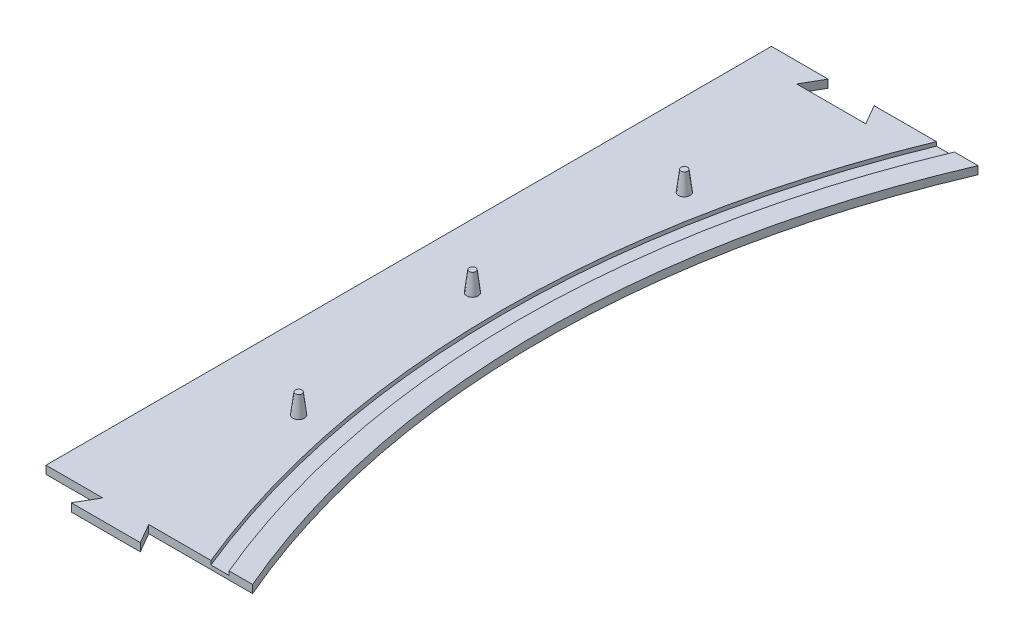
ISO-10303-21;
HEADER;
FILE_DESCRIPTION(('STEP AP214'),'2;1');
FILE_NAME('part.step','',(''),(''),'','','');
FILE_SCHEMA(('AUTOMOTIVE_DESIGN { 1 0 10303 214 1 1 1 1 }'));
ENDSEC;
DATA;
#1=APPLICATION_CONTEXT('core data for automotive mechanical design processes');
#2=APPLICATION_PROTOCOL_DEFINITION('international standard','automotive_design',2000,#1);
#3=PRODUCT_CONTEXT('',#1,'mechanical');
#4=PRODUCT('Part','Part','',(#3));
#5=PRODUCT_RELATED_PRODUCT_CATEGORY('part','',(#4));
#6=PRODUCT_DEFINITION_FORMATION('','',#4);
#7=PRODUCT_DEFINITION_CONTEXT('part definition',#1,'design');
#8=PRODUCT_DEFINITION('design','',#6,#7);
#9=PRODUCT_DEFINITION_SHAPE('','',#8);
#10=(LENGTH_UNIT() NAMED_UNIT(*) SI_UNIT(.MILLI.,.METRE.));
#11=(NAMED_UNIT(*) PLANE_ANGLE_UNIT() SI_UNIT($,.RADIAN.));
#12=(NAMED_UNIT(*) SI_UNIT($,.STERADIAN.) SOLID_ANGLE_UNIT());
#13=UNCERTAINTY_MEASURE_WITH_UNIT(LENGTH_MEASURE(1.E-05),#10,'distance_accuracy_value','');
#14=(GEOMETRIC_REPRESENTATION_CONTEXT(3) GLOBAL_UNCERTAINTY_ASSIGNED_CONTEXT((#13)) GLOBAL_UNIT_ASSIGNED_CONTEXT((#10,
#11,#12)) REPRESENTATION_CONTEXT('',''));
#15=CARTESIAN_POINT('',(0.,0.,0.));
#16=DIRECTION('',(0.,0.,1.));
#17=DIRECTION('',(1.,0.,0.));
#18=AXIS2_PLACEMENT_3D('',#15,#16,#17);
#19=CARTESIAN_POINT('',(0.,0.,0.));
#20=DIRECTION('',(0.,1.,0.));
#21=DIRECTION('',(0.,0.,1.));
#22=AXIS2_PLACEMENT_3D('',#19,#20,#21);
#23=PLANE('',#22);
#24=DIRECTION('',(-1.,0.,0.));
#25=VECTOR('',#24,1.);
#26=CARTESIAN_POINT('',(0.,0.,-90.9999999999999));
#27=LINE('',#26,#25);
#28=CARTESIAN_POINT('',(-212.176813059297,0.,-91.));
#29=VERTEX_POINT('',#28);
#30=CARTESIAN_POINT('',(-218.074964175166,0.,-91.));
#31=VERTEX_POINT('',#30);
#32=EDGE_CURVE('E237',#29,#31,#27,.T.);
#33=ORIENTED_EDGE('',*,*,#32,.T.);
#34=CARTESIAN_POINT('',(0.,0.,0.));
#35=DIRECTION('',(0.,1.,0.));
#36=DIRECTION('',(0.,0.,1.));
#37=AXIS2_PLACEMENT_3D('',#34,#35,#36);
#38=CIRCLE('',#37,236.3);
#39=CARTESIAN_POINT('',(-218.074964175166,0.,91.));
#40=VERTEX_POINT('',#39);
#41=EDGE_CURVE('E52',#31,#40,#38,.T.);
#42=ORIENTED_EDGE('',*,*,#41,.T.);
#43=DIRECTION('',(1.,0.,0.));
#44=VECTOR('',#43,1.);
#45=CARTESIAN_POINT('',(0.,0.,90.9999999999999));
#46=LINE('',#45,#44);
#47=CARTESIAN_POINT('',(-212.176813059297,0.,91.));
#48=VERTEX_POINT('',#47);
#49=EDGE_CURVE('E250',#40,#48,#46,.T.);
#50=ORIENTED_EDGE('',*,*,#49,.T.);
#51=CARTESIAN_POINT('',(0.,0.,0.));
#52=DIRECTION('',(0.,1.,0.));
#53=DIRECTION('',(-0.866025403784443,0.,-0.499999999999992));
#54=AXIS2_PLACEMENT_3D('',#51,#52,#53);
#55=CIRCLE('',#54,230.867927612304);
#56=EDGE_CURVE('E228',#29,#48,#55,.T.);
#57=ORIENTED_EDGE('',*,*,#56,.F.);
#58=EDGE_LOOP('',(#33,#42,#50,#57));
#59=FACE_BOUND('',#58,.T.);
#60=ADVANCED_FACE('F36',(#59),#23,.T.);
#61=CARTESIAN_POINT('',(-200.,8.,-91.));
#62=DIRECTION('',(0.,0.,-1.));
#63=DIRECTION('',(-1.,0.,0.));
#64=AXIS2_PLACEMENT_3D('',#61,#62,#63);
#65=PLANE('',#64);
#66=DIRECTION('',(0.,1.,0.));
#67=VECTOR('',#66,1.);
#68=CARTESIAN_POINT('',(-249.773502691896,8.,-91.));
#69=LINE('',#68,#67);
#70=CARTESIAN_POINT('',(-249.773502691896,-2.,-91.));
#71=VERTEX_POINT('',#70);
#72=CARTESIAN_POINT('',(-249.773502691896,0.,-91.));
#73=VERTEX_POINT('',#72);
#74=EDGE_CURVE('E158',#71,#73,#69,.T.);
#75=ORIENTED_EDGE('',*,*,#74,.F.);
#76=DIRECTION('',(1.,0.,0.));
#77=VECTOR('',#76,1.);
#78=CARTESIAN_POINT('',(-200.,-2.,-91.));
#79=LINE('',#78,#77);
#80=CARTESIAN_POINT('',(-264.,-2.,-91.));
#81=VERTEX_POINT('',#80);
#82=EDGE_CURVE('E251',#81,#71,#79,.T.);
#83=ORIENTED_EDGE('',*,*,#82,.F.);
#84=DIRECTION('',(0.,-1.,0.));
#85=VECTOR('',#84,1.);
#86=CARTESIAN_POINT('',(-264.,-2.,-91.));
#87=LINE('',#86,#85);
#88=CARTESIAN_POINT('',(-264.,0.,-91.));
#89=VERTEX_POINT('',#88);
#90=EDGE_CURVE('E231',#89,#81,#87,.T.);
#91=ORIENTED_EDGE('',*,*,#90,.F.);
#92=EDGE_CURVE('E240',#73,#89,#27,.T.);
#93=ORIENTED_EDGE('',*,*,#92,.F.);
#94=EDGE_LOOP('',(#75,#83,#91,#93));
#95=FACE_BOUND('',#94,.T.);
#96=ADVANCED_FACE('F358',(#95),#65,.T.);
#97=CARTESIAN_POINT('',(-200.,8.,91.));
#98=DIRECTION('',(0.,0.,1.));
#99=DIRECTION('',(1.,0.,0.));
#100=AXIS2_PLACEMENT_3D('',#97,#98,#99);
#101=PLANE('',#100);
#102=DIRECTION('',(0.,-1.,0.));
#103=VECTOR('',#102,1.);
#104=CARTESIAN_POINT('',(-249.773502691896,8.,91.));
#105=LINE('',#104,#103);
#106=CARTESIAN_POINT('',(-249.773502691896,0.,91.));
#107=VERTEX_POINT('',#106);
#108=CARTESIAN_POINT('',(-249.773502691896,-2.,91.));
#109=VERTEX_POINT('',#108);
#110=EDGE_CURVE('E180',#107,#109,#105,.T.);
#111=ORIENTED_EDGE('',*,*,#110,.F.);
#112=CARTESIAN_POINT('',(-264.,0.,91.));
#113=VERTEX_POINT('',#112);
#114=EDGE_CURVE('E245',#113,#107,#46,.T.);
#115=ORIENTED_EDGE('',*,*,#114,.F.);
#116=DIRECTION('',(0.,1.,0.));
#117=VECTOR('',#116,1.);
#118=CARTESIAN_POINT('',(-264.,-2.,91.));
#119=LINE('',#118,#117);
#120=CARTESIAN_POINT('',(-264.,-2.,91.));
#121=VERTEX_POINT('',#120);
#122=EDGE_CURVE('E241',#121,#113,#119,.T.);
#123=ORIENTED_EDGE('',*,*,#122,.F.);
#124=DIRECTION('',(-1.,0.,0.));
#125=VECTOR('',#124,1.);
#126=CARTESIAN_POINT('',(-200.,-2.,91.));
#127=LINE('',#126,#125);
#128=EDGE_CURVE('E260',#109,#121,#127,.T.);
#129=ORIENTED_EDGE('',*,*,#128,.F.);
#130=EDGE_LOOP('',(#111,#115,#123,#129));
#131=FACE_BOUND('',#130,.T.);
#132=ADVANCED_FACE('F362',(#131),#101,.T.);
#133=CARTESIAN_POINT('',(0.,-2.,0.));
#134=DIRECTION('',(0.,1.,0.));
#135=DIRECTION('',(0.,0.,1.));
#136=AXIS2_PLACEMENT_3D('',#133,#134,#135);
#137=PLANE('',#136);
#138=ORIENTED_EDGE('',*,*,#82,.T.);
#139=DIRECTION('',(0.499999999999998,0.,-0.86602540378444));
#140=VECTOR('',#139,1.);
#141=CARTESIAN_POINT('',(-244.,-2.,-101.));
#142=LINE('',#141,#140);
#143=CARTESIAN_POINT('',(-252.660254037844,-2.,-86.));
#144=VERTEX_POINT('',#143);
#145=EDGE_CURVE('E300',#144,#71,#142,.T.);
#146=ORIENTED_EDGE('',*,*,#145,.F.);
#147=DIRECTION('',(-1.,0.,0.));
#148=VECTOR('',#147,1.);
#149=CARTESIAN_POINT('',(-252.660254037844,-2.,-86.));
#150=LINE('',#149,#148);
#151=CARTESIAN_POINT('',(-235.339745962156,-2.,-86.));
#152=VERTEX_POINT('',#151);
#153=EDGE_CURVE('E291',#152,#144,#150,.T.);
#154=ORIENTED_EDGE('',*,*,#153,.F.);
#155=DIRECTION('',(0.500000000000001,0.,0.866025403784438));
#156=VECTOR('',#155,1.);
#157=CARTESIAN_POINT('',(-235.339745962156,-2.,-86.));
#158=LINE('',#157,#156);
#159=CARTESIAN_POINT('',(-238.226497308104,-2.,-91.));
#160=VERTEX_POINT('',#159);
#161=EDGE_CURVE('E284',#160,#152,#158,.T.);
#162=ORIENTED_EDGE('',*,*,#161,.F.);
#163=CARTESIAN_POINT('',(-212.176813059297,-2.,-91.));
#164=VERTEX_POINT('',#163);
#165=EDGE_CURVE('E255',#160,#164,#79,.T.);
#166=ORIENTED_EDGE('',*,*,#165,.T.);
#167=CARTESIAN_POINT('',(0.,-2.,0.));
#168=DIRECTION('',(0.,1.,0.));
#169=DIRECTION('',(-0.866025403784443,0.,-0.499999999999992));
#170=AXIS2_PLACEMENT_3D('',#167,#168,#169);
#171=CIRCLE('',#170,230.867927612304);
#172=CARTESIAN_POINT('',(-212.176813059297,-2.,91.));
#173=VERTEX_POINT('',#172);
#174=EDGE_CURVE('E227',#164,#173,#171,.T.);
#175=ORIENTED_EDGE('',*,*,#174,.T.);
#176=CARTESIAN_POINT('',(-238.226497308104,-2.,91.));
#177=VERTEX_POINT('',#176);
#178=EDGE_CURVE('E256',#173,#177,#127,.T.);
#179=ORIENTED_EDGE('',*,*,#178,.T.);
#180=DIRECTION('',(0.5,0.,0.866025403784438));
#181=VECTOR('',#180,1.);
#182=CARTESIAN_POINT('',(-235.339745962156,-2.,96.));
#183=LINE('',#182,#181);
#184=CARTESIAN_POINT('',(-235.339745962156,-2.,96.));
#185=VERTEX_POINT('',#184);
#186=EDGE_CURVE('E273',#177,#185,#183,.T.);
#187=ORIENTED_EDGE('',*,*,#186,.T.);
#188=DIRECTION('',(-1.,0.,0.));
#189=VECTOR('',#188,1.);
#190=CARTESIAN_POINT('',(-252.660254037844,-2.,96.));
#191=LINE('',#190,#189);
#192=CARTESIAN_POINT('',(-252.660254037844,-2.,96.));
#193=VERTEX_POINT('',#192);
#194=EDGE_CURVE('E261',#185,#193,#191,.T.);
#195=ORIENTED_EDGE('',*,*,#194,.T.);
#196=DIRECTION('',(0.5,0.,-0.866025403784438));
#197=VECTOR('',#196,1.);
#198=CARTESIAN_POINT('',(-244.,-2.,81.));
#199=LINE('',#198,#197);
#200=EDGE_CURVE('E264',#193,#109,#199,.T.);
#201=ORIENTED_EDGE('',*,*,#200,.T.);
#202=ORIENTED_EDGE('',*,*,#128,.T.);
#203=DIRECTION('',(0.,0.,1.));
#204=VECTOR('',#203,1.);
#205=CARTESIAN_POINT('',(-264.,-2.,-131.979594929244));
#206=LINE('',#205,#204);
#207=EDGE_CURVE('E195',#81,#121,#206,.T.);
#208=ORIENTED_EDGE('',*,*,#207,.F.);
#209=EDGE_LOOP('',(#138,#146,#154,#162,#166,#175,#179,#187,#195,#201,#202,#208));
#210=FACE_BOUND('',#209,.T.);
#211=ADVANCED_FACE('F367',(#210),#137,.F.);
#212=CARTESIAN_POINT('',(0.,0.,0.));
#213=DIRECTION('',(0.,1.,0.));
#214=DIRECTION('',(0.,0.,1.));
#215=AXIS2_PLACEMENT_3D('',#212,#213,#214);
#216=CIRCLE('',#215,240.5);
#217=CARTESIAN_POINT('',(-222.619069264068,0.,-91.));
#218=VERTEX_POINT('',#217);
#219=CARTESIAN_POINT('',(-222.619069264068,0.,91.));
#220=VERTEX_POINT('',#219);
#221=EDGE_CURVE('E167',#218,#220,#216,.T.);
#222=ORIENTED_EDGE('',*,*,#221,.F.);
#223=CARTESIAN_POINT('',(-238.226497308104,0.,-91.));
#224=VERTEX_POINT('',#223);
#225=EDGE_CURVE('E60',#218,#224,#27,.T.);
#226=ORIENTED_EDGE('',*,*,#225,.T.);
#227=DIRECTION('',(-0.5,0.,-0.866025403784438));
#228=VECTOR('',#227,1.);
#229=CARTESIAN_POINT('',(-235.339745962156,0.,-86.));
#230=LINE('',#229,#228);
#231=CARTESIAN_POINT('',(-235.339745962156,0.,-86.));
#232=VERTEX_POINT('',#231);
#233=EDGE_CURVE('E303',#232,#224,#230,.T.);
#234=ORIENTED_EDGE('',*,*,#233,.F.);
#235=DIRECTION('',(1.,0.,0.));
#236=VECTOR('',#235,1.);
#237=CARTESIAN_POINT('',(-252.660254037844,0.,-86.));
#238=LINE('',#237,#236);
#239=CARTESIAN_POINT('',(-252.660254037844,0.,-86.));
#240=VERTEX_POINT('',#239);
#241=EDGE_CURVE('E306',#240,#232,#238,.T.);
#242=ORIENTED_EDGE('',*,*,#241,.F.);
#243=DIRECTION('',(-0.499999999999998,0.,0.86602540378444));
#244=VECTOR('',#243,1.);
#245=CARTESIAN_POINT('',(-244.,0.,-101.));
#246=LINE('',#245,#244);
#247=EDGE_CURVE('E296',#73,#240,#246,.T.);
#248=ORIENTED_EDGE('',*,*,#247,.F.);
#249=ORIENTED_EDGE('',*,*,#92,.T.);
#250=DIRECTION('',(0.,0.,1.));
#251=VECTOR('',#250,1.);
#252=CARTESIAN_POINT('',(-264.,0.,0.));
#253=LINE('',#252,#251);
#254=EDGE_CURVE('E196',#89,#113,#253,.T.);
#255=ORIENTED_EDGE('',*,*,#254,.T.);
#256=ORIENTED_EDGE('',*,*,#114,.T.);
#257=DIRECTION('',(-0.5,0.,0.866025403784438));
#258=VECTOR('',#257,1.);
#259=CARTESIAN_POINT('',(-244.,0.,81.));
#260=LINE('',#259,#258);
#261=CARTESIAN_POINT('',(-252.660254037844,0.,96.));
#262=VERTEX_POINT('',#261);
#263=EDGE_CURVE('E281',#107,#262,#260,.T.);
#264=ORIENTED_EDGE('',*,*,#263,.T.);
#265=DIRECTION('',(1.,0.,0.));
#266=VECTOR('',#265,1.);
#267=CARTESIAN_POINT('',(-252.660254037844,0.,96.));
#268=LINE('',#267,#266);
#269=CARTESIAN_POINT('',(-235.339745962156,0.,96.));
#270=VERTEX_POINT('',#269);
#271=EDGE_CURVE('E277',#262,#270,#268,.T.);
#272=ORIENTED_EDGE('',*,*,#271,.T.);
#273=DIRECTION('',(-0.5,0.,-0.866025403784438));
#274=VECTOR('',#273,1.);
#275=CARTESIAN_POINT('',(-235.339745962156,0.,96.));
#276=LINE('',#275,#274);
#277=CARTESIAN_POINT('',(-238.226497308104,0.,91.));
#278=VERTEX_POINT('',#277);
#279=EDGE_CURVE('E270',#270,#278,#276,.T.);
#280=ORIENTED_EDGE('',*,*,#279,.T.);
#281=EDGE_CURVE('E249',#278,#220,#46,.T.);
#282=ORIENTED_EDGE('',*,*,#281,.T.);
#283=EDGE_LOOP('',(#222,#226,#234,#242,#248,#249,#255,#256,#264,#272,#280,#282));
#284=FACE_BOUND('',#283,.T.);
#285=CARTESIAN_POINT('',(-243.234749540002,0.,48.3823998599974));
#286=DIRECTION('',(0.,1.,0.));
#287=DIRECTION('',(0.980785280403232,0.,-0.195090322016118));
#288=AXIS2_PLACEMENT_3D('',#285,#286,#287);
#289=CIRCLE('',#288,1.45);
#290=CARTESIAN_POINT('',(-241.812610883417,0.,48.099518893074));
#291=VERTEX_POINT('',#290);
#292=EDGE_CURVE('E207',#291,#291,#289,.T.);
#293=ORIENTED_EDGE('',*,*,#292,.F.);
#294=EDGE_LOOP('',(#293));
#295=FACE_BOUND('',#294,.T.);
#296=CARTESIAN_POINT('',(-248.,0.,-2.5143953892524E-12));
#297=DIRECTION('',(0.,1.,0.));
#298=DIRECTION('',(1.,0.,0.));
#299=AXIS2_PLACEMENT_3D('',#296,#297,#298);
#300=CIRCLE('',#299,1.45);
#301=CARTESIAN_POINT('',(-246.55,0.,-2.49920744542844E-12));
#302=VERTEX_POINT('',#301);
#303=EDGE_CURVE('E215',#302,#302,#300,.T.);
#304=ORIENTED_EDGE('',*,*,#303,.F.);
#305=EDGE_LOOP('',(#304));
#306=FACE_BOUND('',#305,.T.);
#307=CARTESIAN_POINT('',(-243.234749540001,0.,-48.3823998600023));
#308=DIRECTION('',(0.,1.,0.));
#309=DIRECTION('',(0.980785280403229,0.,0.195090322016139));
#310=AXIS2_PLACEMENT_3D('',#307,#308,#309);
#311=CIRCLE('',#310,1.45);
#312=CARTESIAN_POINT('',(-241.812610883416,0.,-48.0995188930789));
#313=VERTEX_POINT('',#312);
#314=EDGE_CURVE('E223',#313,#313,#311,.T.);
#315=ORIENTED_EDGE('',*,*,#314,.F.);
#316=EDGE_LOOP('',(#315));
#317=FACE_BOUND('',#316,.T.);
#318=ADVANCED_FACE('F339',(#284,#295,#306,#317),#23,.T.);
#319=CARTESIAN_POINT('',(-264.,-2.,0.));
#320=DIRECTION('',(-1.,0.,0.));
#321=DIRECTION('',(0.,0.,1.));
#322=AXIS2_PLACEMENT_3D('',#319,#320,#321);
#323=PLANE('',#322);
#324=ORIENTED_EDGE('',*,*,#254,.F.);
#325=ORIENTED_EDGE('',*,*,#90,.T.);
#326=ORIENTED_EDGE('',*,*,#207,.T.);
#327=ORIENTED_EDGE('',*,*,#122,.T.);
#328=EDGE_LOOP('',(#324,#325,#326,#327));
#329=FACE_BOUND('',#328,.T.);
#330=ADVANCED_FACE('F38',(#329),#323,.T.);
#331=CARTESIAN_POINT('',(0.,-2.,0.));
#332=DIRECTION('',(0.,1.,0.));
#333=DIRECTION('',(0.,0.,1.));
#334=AXIS2_PLACEMENT_3D('',#331,#332,#333);
#335=CYLINDRICAL_SURFACE('',#334,230.867927612304);
#336=DIRECTION('',(0.,1.,0.));
#337=VECTOR('',#336,1.);
#338=CARTESIAN_POINT('',(-212.176813059297,-2.,-91.));
#339=LINE('',#338,#337);
#340=EDGE_CURVE('E187',#29,#164,#339,.F.);
#341=ORIENTED_EDGE('',*,*,#340,.F.);
#342=ORIENTED_EDGE('',*,*,#56,.T.);
#343=DIRECTION('',(0.,1.,0.));
#344=VECTOR('',#343,1.);
#345=CARTESIAN_POINT('',(-212.176813059297,-2.,91.));
#346=LINE('',#345,#344);
#347=EDGE_CURVE('E191',#173,#48,#346,.T.);
#348=ORIENTED_EDGE('',*,*,#347,.F.);
#349=ORIENTED_EDGE('',*,*,#174,.F.);
#350=EDGE_LOOP('',(#341,#342,#348,#349));
#351=FACE_BOUND('',#350,.T.);
#352=ADVANCED_FACE('F372',(#351),#335,.F.);
#353=CARTESIAN_POINT('',(-243.234749540002,0.,48.3823998599974));
#354=DIRECTION('',(0.,-1.,0.));
#355=DIRECTION('',(0.980785280403232,0.,-0.195090322016118));
#356=AXIS2_PLACEMENT_3D('',#353,#354,#355);
#357=CONICAL_SURFACE('',#356,1.45,0.122173047639603);
#358=CARTESIAN_POINT('',(-243.234749540002,5.,48.3823998599974));
#359=DIRECTION('',(0.,1.,0.));
#360=DIRECTION('',(0.,0.,1.));
#361=AXIS2_PLACEMENT_3D('',#358,#359,#360);
#362=CIRCLE('',#361,0.836077195485479);
#363=CARTESIAN_POINT('',(-243.234749540002,5.,49.2184770554829));
#364=VERTEX_POINT('',#363);
#365=EDGE_CURVE('E200',#364,#364,#362,.T.);
#366=ORIENTED_EDGE('',*,*,#365,.F.);
#367=EDGE_LOOP('',(#366));
#368=FACE_BOUND('',#367,.T.);
#369=ORIENTED_EDGE('',*,*,#292,.T.);
#370=EDGE_LOOP('',(#369));
#371=FACE_BOUND('',#370,.T.);
#372=ADVANCED_FACE('F381',(#368,#371),#357,.T.);
#373=CARTESIAN_POINT('',(-243.234749540002,5.,48.3823998599974));
#374=DIRECTION('',(0.,1.,0.));
#375=DIRECTION('',(0.980785280403232,0.,-0.195090322016118));
#376=AXIS2_PLACEMENT_3D('',#373,#374,#375);
#377=PLANE('',#376);
#378=ORIENTED_EDGE('',*,*,#365,.T.);
#379=EDGE_LOOP('',(#378));
#380=FACE_BOUND('',#379,.T.);
#381=ADVANCED_FACE('F384',(#380),#377,.T.);
#382=CARTESIAN_POINT('',(-248.,0.,-2.5143953892524E-12));
#383=DIRECTION('',(0.,-1.,0.));
#384=DIRECTION('',(1.,0.,0.));
#385=AXIS2_PLACEMENT_3D('',#382,#383,#384);
#386=CONICAL_SURFACE('',#385,1.45,0.122173047639603);
#387=CARTESIAN_POINT('',(-248.,5.,-2.5143953892524E-12));
#388=DIRECTION('',(0.,1.,0.));
#389=DIRECTION('',(0.,0.,1.));
#390=AXIS2_PLACEMENT_3D('',#387,#388,#389);
#391=CIRCLE('',#390,0.836077195485479);
#392=CARTESIAN_POINT('',(-248.,5.,0.836077195482964));
#393=VERTEX_POINT('',#392);
#394=EDGE_CURVE('E211',#393,#393,#391,.T.);
#395=ORIENTED_EDGE('',*,*,#394,.F.);
#396=EDGE_LOOP('',(#395));
#397=FACE_BOUND('',#396,.T.);
#398=ORIENTED_EDGE('',*,*,#303,.T.);
#399=EDGE_LOOP('',(#398));
#400=FACE_BOUND('',#399,.T.);
#401=ADVANCED_FACE('F388',(#397,#400),#386,.T.);
#402=CARTESIAN_POINT('',(-248.,5.,-2.5143953892524E-12));
#403=DIRECTION('',(0.,1.,0.));
#404=DIRECTION('',(1.,0.,0.));
#405=AXIS2_PLACEMENT_3D('',#402,#403,#404);
#406=PLANE('',#405);
#407=ORIENTED_EDGE('',*,*,#394,.T.);
#408=EDGE_LOOP('',(#407));
#409=FACE_BOUND('',#408,.T.);
#410=ADVANCED_FACE('F392',(#409),#406,.T.);
#411=CARTESIAN_POINT('',(-243.234749540001,0.,-48.3823998600023));
#412=DIRECTION('',(0.,-1.,0.));
#413=DIRECTION('',(0.980785280403229,0.,0.195090322016139));
#414=AXIS2_PLACEMENT_3D('',#411,#412,#413);
#415=CONICAL_SURFACE('',#414,1.45,0.122173047639603);
#416=CARTESIAN_POINT('',(-243.234749540001,5.,-48.3823998600023));
#417=DIRECTION('',(0.,1.,0.));
#418=DIRECTION('',(0.,0.,1.));
#419=AXIS2_PLACEMENT_3D('',#416,#417,#418);
#420=CIRCLE('',#419,0.836077195485479);
#421=CARTESIAN_POINT('',(-243.234749540001,5.,-47.5463226645169));
#422=VERTEX_POINT('',#421);
#423=EDGE_CURVE('E219',#422,#422,#420,.T.);
#424=ORIENTED_EDGE('',*,*,#423,.F.);
#425=EDGE_LOOP('',(#424));
#426=FACE_BOUND('',#425,.T.);
#427=ORIENTED_EDGE('',*,*,#314,.T.);
#428=EDGE_LOOP('',(#427));
#429=FACE_BOUND('',#428,.T.);
#430=ADVANCED_FACE('F396',(#426,#429),#415,.T.);
#431=CARTESIAN_POINT('',(-243.234749540001,5.,-48.3823998600023));
#432=DIRECTION('',(0.,1.,0.));
#433=DIRECTION('',(0.980785280403229,0.,0.195090322016139));
#434=AXIS2_PLACEMENT_3D('',#431,#432,#433);
#435=PLANE('',#434);
#436=ORIENTED_EDGE('',*,*,#423,.T.);
#437=EDGE_LOOP('',(#436));
#438=FACE_BOUND('',#437,.T.);
#439=ADVANCED_FACE('F400',(#438),#435,.T.);
#440=DIRECTION('',(0.,1.,0.));
#441=VECTOR('',#440,1.);
#442=CARTESIAN_POINT('',(-222.619069264068,-1.,91.));
#443=LINE('',#442,#441);
#444=CARTESIAN_POINT('',(-222.619069264068,-1.,91.));
#445=VERTEX_POINT('',#444);
#446=EDGE_CURVE('E310',#220,#445,#443,.F.);
#447=ORIENTED_EDGE('',*,*,#446,.F.);
#448=ORIENTED_EDGE('',*,*,#281,.F.);
#449=DIRECTION('',(0.,1.,0.));
#450=VECTOR('',#449,1.);
#451=CARTESIAN_POINT('',(-238.226497308104,8.,91.));
#452=LINE('',#451,#450);
#453=EDGE_CURVE('E184',#177,#278,#452,.T.);
#454=ORIENTED_EDGE('',*,*,#453,.F.);
#455=ORIENTED_EDGE('',*,*,#178,.F.);
#456=ORIENTED_EDGE('',*,*,#347,.T.);
#457=ORIENTED_EDGE('',*,*,#49,.F.);
#458=DIRECTION('',(0.,1.,0.));
#459=VECTOR('',#458,1.);
#460=CARTESIAN_POINT('',(-218.074964175166,-1.,91.));
#461=LINE('',#460,#459);
#462=CARTESIAN_POINT('',(-218.074964175166,-1.,91.));
#463=VERTEX_POINT('',#462);
#464=EDGE_CURVE('E319',#40,#463,#461,.F.);
#465=ORIENTED_EDGE('',*,*,#464,.T.);
#466=DIRECTION('',(-1.,0.,0.));
#467=VECTOR('',#466,1.);
#468=CARTESIAN_POINT('',(-200.,-1.,91.));
#469=LINE('',#468,#467);
#470=EDGE_CURVE('E165',#463,#445,#469,.T.);
#471=ORIENTED_EDGE('',*,*,#470,.T.);
#472=EDGE_LOOP('',(#447,#448,#454,#455,#456,#457,#465,#471));
#473=FACE_BOUND('',#472,.T.);
#474=ADVANCED_FACE('F333',(#473),#101,.T.);
#475=DIRECTION('',(0.,1.,0.));
#476=VECTOR('',#475,1.);
#477=CARTESIAN_POINT('',(-222.619069264068,-1.,-91.));
#478=LINE('',#477,#476);
#479=CARTESIAN_POINT('',(-222.619069264068,-1.,-91.));
#480=VERTEX_POINT('',#479);
#481=EDGE_CURVE('E11',#480,#218,#478,.T.);
#482=ORIENTED_EDGE('',*,*,#481,.F.);
#483=DIRECTION('',(1.,0.,0.));
#484=VECTOR('',#483,1.);
#485=CARTESIAN_POINT('',(-200.,-1.,-91.));
#486=LINE('',#485,#484);
#487=CARTESIAN_POINT('',(-218.074964175166,-1.,-91.));
#488=VERTEX_POINT('',#487);
#489=EDGE_CURVE('E45',#480,#488,#486,.T.);
#490=ORIENTED_EDGE('',*,*,#489,.T.);
#491=DIRECTION('',(0.,1.,0.));
#492=VECTOR('',#491,1.);
#493=CARTESIAN_POINT('',(-218.074964175166,-1.,-91.));
#494=LINE('',#493,#492);
#495=EDGE_CURVE('E149',#488,#31,#494,.T.);
#496=ORIENTED_EDGE('',*,*,#495,.T.);
#497=ORIENTED_EDGE('',*,*,#32,.F.);
#498=ORIENTED_EDGE('',*,*,#340,.T.);
#499=ORIENTED_EDGE('',*,*,#165,.F.);
#500=DIRECTION('',(0.,-1.,0.));
#501=VECTOR('',#500,1.);
#502=CARTESIAN_POINT('',(-238.226497308104,8.,-91.));
#503=LINE('',#502,#501);
#504=EDGE_CURVE('E177',#224,#160,#503,.T.);
#505=ORIENTED_EDGE('',*,*,#504,.F.);
#506=ORIENTED_EDGE('',*,*,#225,.F.);
#507=EDGE_LOOP('',(#482,#490,#496,#497,#498,#499,#505,#506));
#508=FACE_BOUND('',#507,.T.);
#509=ADVANCED_FACE('F170',(#508),#65,.T.);
#510=CARTESIAN_POINT('',(-244.,-24.9128784747792,81.));
#511=DIRECTION('',(-0.866025403784438,0.,-0.5));
#512=DIRECTION('',(-0.5,0.,0.866025403784438));
#513=AXIS2_PLACEMENT_3D('',#510,#511,#512);
#514=PLANE('',#513);
#515=ORIENTED_EDGE('',*,*,#263,.F.);
#516=ORIENTED_EDGE('',*,*,#110,.T.);
#517=ORIENTED_EDGE('',*,*,#200,.F.);
#518=DIRECTION('',(0.,1.,0.));
#519=VECTOR('',#518,1.);
#520=CARTESIAN_POINT('',(-252.660254037844,-24.9128784747792,96.));
#521=LINE('',#520,#519);
#522=EDGE_CURVE('E265',#193,#262,#521,.T.);
#523=ORIENTED_EDGE('',*,*,#522,.T.);
#524=EDGE_LOOP('',(#515,#516,#517,#523));
#525=FACE_BOUND('',#524,.T.);
#526=ADVANCED_FACE('F410',(#525),#514,.T.);
#527=CARTESIAN_POINT('',(-235.339745962156,-24.9128784747792,96.));
#528=DIRECTION('',(0.866025403784438,0.,-0.5));
#529=DIRECTION('',(-0.5,0.,-0.866025403784438));
#530=AXIS2_PLACEMENT_3D('',#527,#528,#529);
#531=PLANE('',#530);
#532=ORIENTED_EDGE('',*,*,#186,.F.);
#533=ORIENTED_EDGE('',*,*,#453,.T.);
#534=ORIENTED_EDGE('',*,*,#279,.F.);
#535=DIRECTION('',(0.,1.,0.));
#536=VECTOR('',#535,1.);
#537=CARTESIAN_POINT('',(-235.339745962156,-24.9128784747792,96.));
#538=LINE('',#537,#536);
#539=EDGE_CURVE('E269',#185,#270,#538,.T.);
#540=ORIENTED_EDGE('',*,*,#539,.F.);
#541=EDGE_LOOP('',(#532,#533,#534,#540));
#542=FACE_BOUND('',#541,.T.);
#543=ADVANCED_FACE('F413',(#542),#531,.T.);
#544=CARTESIAN_POINT('',(-252.660254037844,-24.9128784747792,96.));
#545=DIRECTION('',(0.,0.,1.));
#546=DIRECTION('',(1.,0.,0.));
#547=AXIS2_PLACEMENT_3D('',#544,#545,#546);
#548=PLANE('',#547);
#549=ORIENTED_EDGE('',*,*,#194,.F.);
#550=ORIENTED_EDGE('',*,*,#539,.T.);
#551=ORIENTED_EDGE('',*,*,#271,.F.);
#552=ORIENTED_EDGE('',*,*,#522,.F.);
#553=EDGE_LOOP('',(#549,#550,#551,#552));
#554=FACE_BOUND('',#553,.T.);
#555=ADVANCED_FACE('F415',(#554),#548,.T.);
#556=CARTESIAN_POINT('',(-252.660254037844,-24.9128784747791,-86.));
#557=DIRECTION('',(0.,0.,1.));
#558=DIRECTION('',(1.,0.,0.));
#559=AXIS2_PLACEMENT_3D('',#556,#557,#558);
#560=PLANE('',#559);
#561=ORIENTED_EDGE('',*,*,#153,.T.);
#562=DIRECTION('',(0.,1.,0.));
#563=VECTOR('',#562,1.);
#564=CARTESIAN_POINT('',(-252.660254037844,-24.9128784747791,-86.));
#565=LINE('',#564,#563);
#566=EDGE_CURVE('E295',#144,#240,#565,.T.);
#567=ORIENTED_EDGE('',*,*,#566,.T.);
#568=ORIENTED_EDGE('',*,*,#241,.T.);
#569=DIRECTION('',(0.,1.,0.));
#570=VECTOR('',#569,1.);
#571=CARTESIAN_POINT('',(-235.339745962156,-24.9128784747791,-86.));
#572=LINE('',#571,#570);
#573=EDGE_CURVE('E292',#152,#232,#572,.T.);
#574=ORIENTED_EDGE('',*,*,#573,.F.);
#575=EDGE_LOOP('',(#561,#567,#568,#574));
#576=FACE_BOUND('',#575,.T.);
#577=ADVANCED_FACE('F418',(#576),#560,.F.);
#578=CARTESIAN_POINT('',(-244.,-24.9128784747791,-101.));
#579=DIRECTION('',(-0.86602540378444,0.,-0.499999999999998));
#580=DIRECTION('',(-0.499999999999998,0.,0.86602540378444));
#581=AXIS2_PLACEMENT_3D('',#578,#579,#580);
#582=PLANE('',#581);
#583=ORIENTED_EDGE('',*,*,#74,.T.);
#584=ORIENTED_EDGE('',*,*,#247,.T.);
#585=ORIENTED_EDGE('',*,*,#566,.F.);
#586=ORIENTED_EDGE('',*,*,#145,.T.);
#587=EDGE_LOOP('',(#583,#584,#585,#586));
#588=FACE_BOUND('',#587,.T.);
#589=ADVANCED_FACE('F353',(#588),#582,.F.);
#590=CARTESIAN_POINT('',(-235.339745962156,-24.9128784747791,-86.));
#591=DIRECTION('',(0.866025403784438,0.,-0.5));
#592=DIRECTION('',(-0.500000000000001,0.,-0.866025403784438));
#593=AXIS2_PLACEMENT_3D('',#590,#591,#592);
#594=PLANE('',#593);
#595=ORIENTED_EDGE('',*,*,#504,.T.);
#596=ORIENTED_EDGE('',*,*,#161,.T.);
#597=ORIENTED_EDGE('',*,*,#573,.T.);
#598=ORIENTED_EDGE('',*,*,#233,.T.);
#599=EDGE_LOOP('',(#595,#596,#597,#598));
#600=FACE_BOUND('',#599,.T.);
#601=ADVANCED_FACE('F346',(#600),#594,.F.);
#602=CARTESIAN_POINT('',(0.,-1.,0.));
#603=DIRECTION('',(0.,1.,0.));
#604=DIRECTION('',(0.,0.,1.));
#605=AXIS2_PLACEMENT_3D('',#602,#603,#604);
#606=CYLINDRICAL_SURFACE('',#605,240.5);
#607=ORIENTED_EDGE('',*,*,#446,.T.);
#608=CARTESIAN_POINT('',(0.,-1.,0.));
#609=DIRECTION('',(0.,1.,0.));
#610=DIRECTION('',(0.,0.,1.));
#611=AXIS2_PLACEMENT_3D('',#608,#609,#610);
#612=CIRCLE('',#611,240.5);
#613=EDGE_CURVE('E322',#480,#445,#612,.T.);
#614=ORIENTED_EDGE('',*,*,#613,.F.);
#615=ORIENTED_EDGE('',*,*,#481,.T.);
#616=ORIENTED_EDGE('',*,*,#221,.T.);
#617=EDGE_LOOP('',(#607,#614,#615,#616));
#618=FACE_BOUND('',#617,.T.);
#619=ADVANCED_FACE('F344',(#618),#606,.F.);
#620=CARTESIAN_POINT('',(0.,-1.,0.));
#621=DIRECTION('',(0.,1.,0.));
#622=DIRECTION('',(0.,0.,1.));
#623=AXIS2_PLACEMENT_3D('',#620,#621,#622);
#624=PLANE('',#623);
#625=CARTESIAN_POINT('',(0.,-1.,0.));
#626=DIRECTION('',(0.,1.,0.));
#627=DIRECTION('',(0.,0.,1.));
#628=AXIS2_PLACEMENT_3D('',#625,#626,#627);
#629=CIRCLE('',#628,236.3);
#630=EDGE_CURVE('E152',#488,#463,#629,.T.);
#631=ORIENTED_EDGE('',*,*,#630,.F.);
#632=ORIENTED_EDGE('',*,*,#489,.F.);
#633=ORIENTED_EDGE('',*,*,#613,.T.);
#634=ORIENTED_EDGE('',*,*,#470,.F.);
#635=EDGE_LOOP('',(#631,#632,#633,#634));
#636=FACE_BOUND('',#635,.T.);
#637=ADVANCED_FACE('F161',(#636),#624,.T.);
#638=CARTESIAN_POINT('',(0.,-1.,0.));
#639=DIRECTION('',(0.,1.,0.));
#640=DIRECTION('',(0.,0.,1.));
#641=AXIS2_PLACEMENT_3D('',#638,#639,#640);
#642=CYLINDRICAL_SURFACE('',#641,236.3);
#643=ORIENTED_EDGE('',*,*,#41,.F.);
#644=ORIENTED_EDGE('',*,*,#495,.F.);
#645=ORIENTED_EDGE('',*,*,#630,.T.);
#646=ORIENTED_EDGE('',*,*,#464,.F.);
#647=EDGE_LOOP('',(#643,#644,#645,#646));
#648=FACE_BOUND('',#647,.T.);
#649=ADVANCED_FACE('F151',(#648),#642,.T.);
#650=CLOSED_SHELL('',(#60,#96,#132,#211,#318,#330,#352,#372,#381,#401,#410,#430,#439,#474,#509,
#526,#543,#555,#577,#589,#601,#619,#637,#649));
#651=MANIFOLD_SOLID_BREP('B2',#650);
#652=ADVANCED_BREP_SHAPE_REPRESENTATION('',(#18,#651),#14);
#653=SHAPE_DEFINITION_REPRESENTATION(#9,#652);
ENDSEC;
END-ISO-10303-21;
